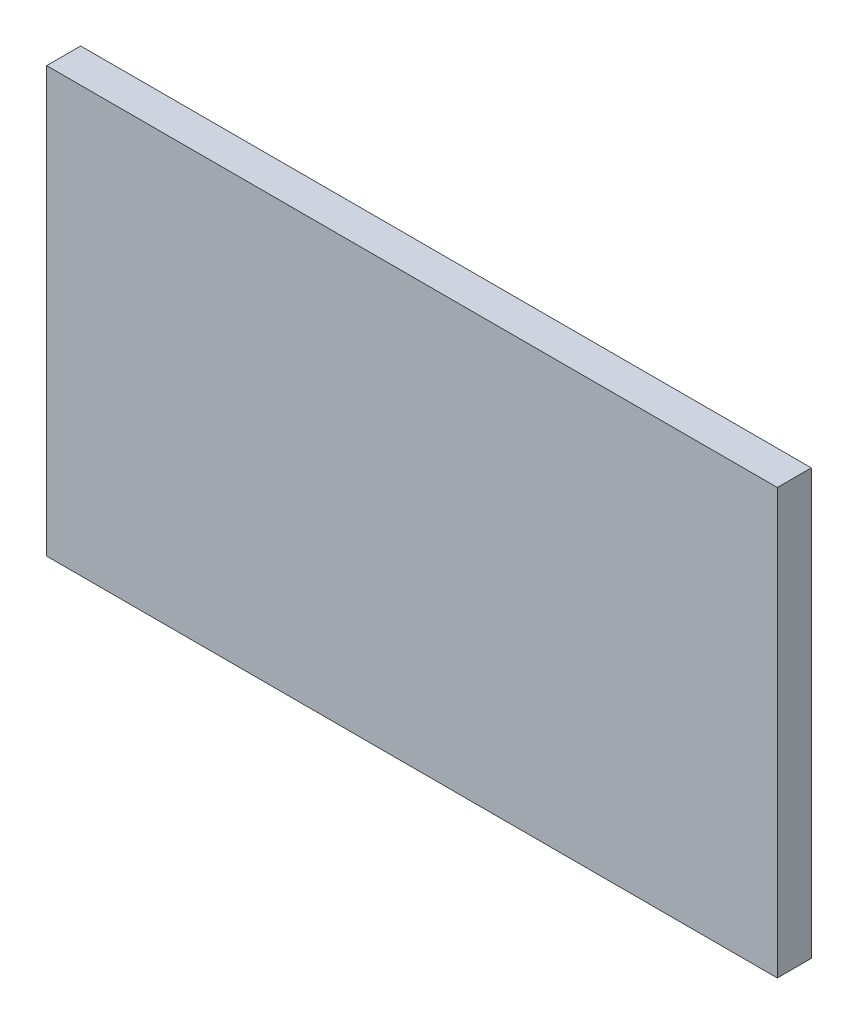
ISO-10303-21;
HEADER;
FILE_DESCRIPTION(('STEP AP214'),'2;1');
FILE_NAME('part.step','',(''),(''),'','','');
FILE_SCHEMA(('AUTOMOTIVE_DESIGN { 1 0 10303 214 1 1 1 1 }'));
ENDSEC;
DATA;
#1=APPLICATION_CONTEXT('core data for automotive mechanical design processes');
#2=APPLICATION_PROTOCOL_DEFINITION('international standard','automotive_design',2000,#1);
#3=PRODUCT_CONTEXT('',#1,'mechanical');
#4=PRODUCT('Part','Part','',(#3));
#5=PRODUCT_RELATED_PRODUCT_CATEGORY('part','',(#4));
#6=PRODUCT_DEFINITION_FORMATION('','',#4);
#7=PRODUCT_DEFINITION_CONTEXT('part definition',#1,'design');
#8=PRODUCT_DEFINITION('design','',#6,#7);
#9=PRODUCT_DEFINITION_SHAPE('','',#8);
#10=(LENGTH_UNIT() NAMED_UNIT(*) SI_UNIT(.MILLI.,.METRE.));
#11=(NAMED_UNIT(*) PLANE_ANGLE_UNIT() SI_UNIT($,.RADIAN.));
#12=(NAMED_UNIT(*) SI_UNIT($,.STERADIAN.) SOLID_ANGLE_UNIT());
#13=UNCERTAINTY_MEASURE_WITH_UNIT(LENGTH_MEASURE(1.E-05),#10,'distance_accuracy_value','');
#14=(GEOMETRIC_REPRESENTATION_CONTEXT(3) GLOBAL_UNCERTAINTY_ASSIGNED_CONTEXT((#13)) GLOBAL_UNIT_ASSIGNED_CONTEXT((#10,
#11,#12)) REPRESENTATION_CONTEXT('',''));
#15=CARTESIAN_POINT('',(0.,0.,0.));
#16=DIRECTION('',(0.,0.,1.));
#17=DIRECTION('',(1.,0.,0.));
#18=AXIS2_PLACEMENT_3D('',#15,#16,#17);
#19=CARTESIAN_POINT('',(0.,0.,4.));
#20=DIRECTION('',(1.,0.,0.));
#21=DIRECTION('',(0.,0.,-1.));
#22=AXIS2_PLACEMENT_3D('',#19,#20,#21);
#23=PLANE('',#22);
#24=DIRECTION('',(0.,-1.,0.));
#25=VECTOR('',#24,1.);
#26=CARTESIAN_POINT('',(0.,0.,0.));
#27=LINE('',#26,#25);
#28=CARTESIAN_POINT('',(0.,50.,0.));
#29=VERTEX_POINT('',#28);
#30=CARTESIAN_POINT('',(0.,0.,0.));
#31=VERTEX_POINT('',#30);
#32=EDGE_CURVE('E96',#29,#31,#27,.T.);
#33=ORIENTED_EDGE('',*,*,#32,.T.);
#34=DIRECTION('',(0.,0.,-1.));
#35=VECTOR('',#34,1.);
#36=CARTESIAN_POINT('',(0.,0.,4.));
#37=LINE('',#36,#35);
#38=CARTESIAN_POINT('',(0.,0.,4.));
#39=VERTEX_POINT('',#38);
#40=EDGE_CURVE('E11',#39,#31,#37,.T.);
#41=ORIENTED_EDGE('',*,*,#40,.F.);
#42=DIRECTION('',(0.,-1.,0.));
#43=VECTOR('',#42,1.);
#44=CARTESIAN_POINT('',(0.,0.,4.));
#45=LINE('',#44,#43);
#46=CARTESIAN_POINT('',(0.,50.,4.));
#47=VERTEX_POINT('',#46);
#48=EDGE_CURVE('E84',#47,#39,#45,.T.);
#49=ORIENTED_EDGE('',*,*,#48,.F.);
#50=DIRECTION('',(0.,0.,-1.));
#51=VECTOR('',#50,1.);
#52=CARTESIAN_POINT('',(0.,50.,4.));
#53=LINE('',#52,#51);
#54=EDGE_CURVE('E92',#47,#29,#53,.T.);
#55=ORIENTED_EDGE('',*,*,#54,.T.);
#56=EDGE_LOOP('',(#33,#41,#49,#55));
#57=FACE_BOUND('',#56,.T.);
#58=ADVANCED_FACE('F33',(#57),#23,.F.);
#59=CARTESIAN_POINT('',(0.,0.,4.));
#60=DIRECTION('',(0.,1.,0.));
#61=DIRECTION('',(0.,0.,1.));
#62=AXIS2_PLACEMENT_3D('',#59,#60,#61);
#63=PLANE('',#62);
#64=DIRECTION('',(1.,0.,0.));
#65=VECTOR('',#64,1.);
#66=CARTESIAN_POINT('',(0.,0.,0.));
#67=LINE('',#66,#65);
#68=CARTESIAN_POINT('',(86.,0.,0.));
#69=VERTEX_POINT('',#68);
#70=EDGE_CURVE('E88',#31,#69,#67,.T.);
#71=ORIENTED_EDGE('',*,*,#70,.T.);
#72=DIRECTION('',(0.,0.,-1.));
#73=VECTOR('',#72,1.);
#74=CARTESIAN_POINT('',(86.,0.,4.));
#75=LINE('',#74,#73);
#76=CARTESIAN_POINT('',(86.,0.,4.));
#77=VERTEX_POINT('',#76);
#78=EDGE_CURVE('E41',#77,#69,#75,.T.);
#79=ORIENTED_EDGE('',*,*,#78,.F.);
#80=DIRECTION('',(1.,0.,0.));
#81=VECTOR('',#80,1.);
#82=CARTESIAN_POINT('',(0.,0.,4.));
#83=LINE('',#82,#81);
#84=EDGE_CURVE('E79',#39,#77,#83,.T.);
#85=ORIENTED_EDGE('',*,*,#84,.F.);
#86=ORIENTED_EDGE('',*,*,#40,.T.);
#87=EDGE_LOOP('',(#71,#79,#85,#86));
#88=FACE_BOUND('',#87,.T.);
#89=ADVANCED_FACE('F87',(#88),#63,.F.);
#90=CARTESIAN_POINT('',(86.,0.,4.));
#91=DIRECTION('',(-1.,0.,0.));
#92=DIRECTION('',(0.,0.,1.));
#93=AXIS2_PLACEMENT_3D('',#90,#91,#92);
#94=PLANE('',#93);
#95=DIRECTION('',(0.,1.,0.));
#96=VECTOR('',#95,1.);
#97=CARTESIAN_POINT('',(86.,0.,0.));
#98=LINE('',#97,#96);
#99=CARTESIAN_POINT('',(86.,50.,0.));
#100=VERTEX_POINT('',#99);
#101=EDGE_CURVE('E66',#69,#100,#98,.T.);
#102=ORIENTED_EDGE('',*,*,#101,.T.);
#103=DIRECTION('',(0.,0.,-1.));
#104=VECTOR('',#103,1.);
#105=CARTESIAN_POINT('',(86.,50.,4.));
#106=LINE('',#105,#104);
#107=CARTESIAN_POINT('',(86.,50.,4.));
#108=VERTEX_POINT('',#107);
#109=EDGE_CURVE('E89',#108,#100,#106,.T.);
#110=ORIENTED_EDGE('',*,*,#109,.F.);
#111=DIRECTION('',(0.,1.,0.));
#112=VECTOR('',#111,1.);
#113=CARTESIAN_POINT('',(86.,0.,4.));
#114=LINE('',#113,#112);
#115=EDGE_CURVE('E82',#77,#108,#114,.T.);
#116=ORIENTED_EDGE('',*,*,#115,.F.);
#117=ORIENTED_EDGE('',*,*,#78,.T.);
#118=EDGE_LOOP('',(#102,#110,#116,#117));
#119=FACE_BOUND('',#118,.T.);
#120=ADVANCED_FACE('F90',(#119),#94,.F.);
#121=CARTESIAN_POINT('',(0.,50.,4.));
#122=DIRECTION('',(0.,-1.,0.));
#123=DIRECTION('',(0.,0.,-1.));
#124=AXIS2_PLACEMENT_3D('',#121,#122,#123);
#125=PLANE('',#124);
#126=DIRECTION('',(-1.,0.,0.));
#127=VECTOR('',#126,1.);
#128=CARTESIAN_POINT('',(0.,50.,0.));
#129=LINE('',#128,#127);
#130=EDGE_CURVE('E72',#100,#29,#129,.T.);
#131=ORIENTED_EDGE('',*,*,#130,.T.);
#132=ORIENTED_EDGE('',*,*,#54,.F.);
#133=DIRECTION('',(-1.,0.,0.));
#134=VECTOR('',#133,1.);
#135=CARTESIAN_POINT('',(0.,50.,4.));
#136=LINE('',#135,#134);
#137=EDGE_CURVE('E49',#108,#47,#136,.T.);
#138=ORIENTED_EDGE('',*,*,#137,.F.);
#139=ORIENTED_EDGE('',*,*,#109,.T.);
#140=EDGE_LOOP('',(#131,#132,#138,#139));
#141=FACE_BOUND('',#140,.T.);
#142=ADVANCED_FACE('F103',(#141),#125,.F.);
#143=CARTESIAN_POINT('',(0.,0.,4.));
#144=DIRECTION('',(0.,0.,-1.));
#145=DIRECTION('',(-1.,0.,0.));
#146=AXIS2_PLACEMENT_3D('',#143,#144,#145);
#147=PLANE('',#146);
#148=ORIENTED_EDGE('',*,*,#48,.T.);
#149=ORIENTED_EDGE('',*,*,#84,.T.);
#150=ORIENTED_EDGE('',*,*,#115,.T.);
#151=ORIENTED_EDGE('',*,*,#137,.T.);
#152=EDGE_LOOP('',(#148,#149,#150,#151));
#153=FACE_BOUND('',#152,.T.);
#154=ADVANCED_FACE('F80',(#153),#147,.F.);
#155=CARTESIAN_POINT('',(0.,0.,0.));
#156=DIRECTION('',(0.,0.,-1.));
#157=DIRECTION('',(-1.,0.,0.));
#158=AXIS2_PLACEMENT_3D('',#155,#156,#157);
#159=PLANE('',#158);
#160=ORIENTED_EDGE('',*,*,#32,.F.);
#161=ORIENTED_EDGE('',*,*,#130,.F.);
#162=ORIENTED_EDGE('',*,*,#101,.F.);
#163=ORIENTED_EDGE('',*,*,#70,.F.);
#164=EDGE_LOOP('',(#160,#161,#162,#163));
#165=FACE_BOUND('',#164,.T.);
#166=ADVANCED_FACE('F106',(#165),#159,.T.);
#167=CLOSED_SHELL('',(#58,#89,#120,#142,#154,#166));
#168=MANIFOLD_SOLID_BREP('B2',#167);
#169=ADVANCED_BREP_SHAPE_REPRESENTATION('',(#18,#168),#14);
#170=SHAPE_DEFINITION_REPRESENTATION(#9,#169);
ENDSEC;
END-ISO-10303-21;
